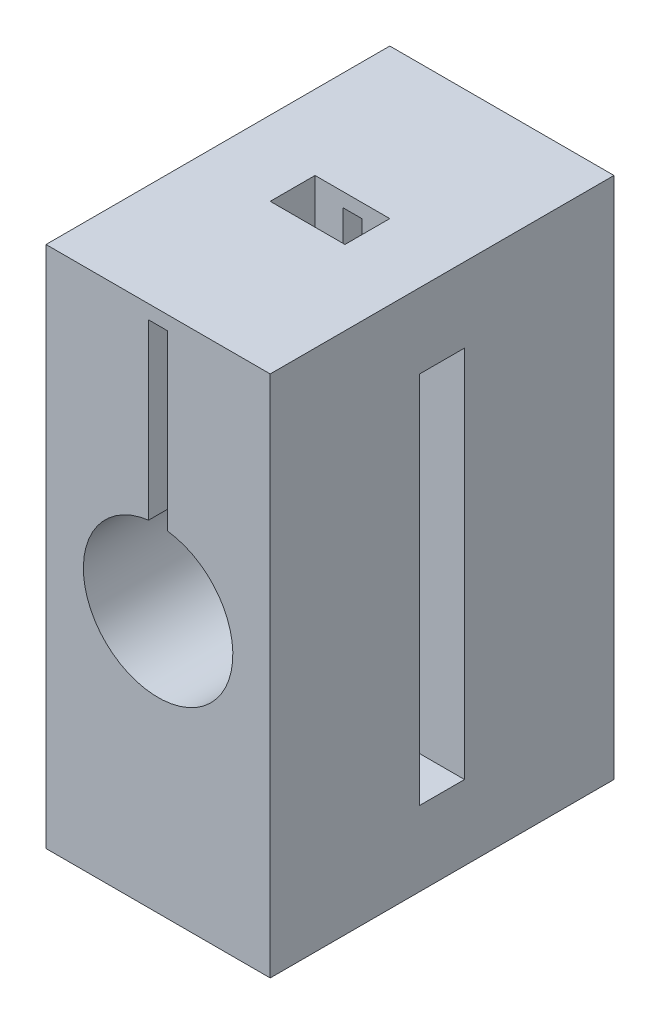
ISO-10303-21;
HEADER;
FILE_DESCRIPTION(('STEP AP214'),'2;1');
FILE_NAME('part.step','',(''),(''),'','','');
FILE_SCHEMA(('AUTOMOTIVE_DESIGN { 1 0 10303 214 1 1 1 1 }'));
ENDSEC;
DATA;
#1=APPLICATION_CONTEXT('core data for automotive mechanical design processes');
#2=APPLICATION_PROTOCOL_DEFINITION('international standard','automotive_design',2000,#1);
#3=PRODUCT_CONTEXT('',#1,'mechanical');
#4=PRODUCT('Part','Part','',(#3));
#5=PRODUCT_RELATED_PRODUCT_CATEGORY('part','',(#4));
#6=PRODUCT_DEFINITION_FORMATION('','',#4);
#7=PRODUCT_DEFINITION_CONTEXT('part definition',#1,'design');
#8=PRODUCT_DEFINITION('design','',#6,#7);
#9=PRODUCT_DEFINITION_SHAPE('','',#8);
#10=(LENGTH_UNIT() NAMED_UNIT(*) SI_UNIT(.MILLI.,.METRE.));
#11=(NAMED_UNIT(*) PLANE_ANGLE_UNIT() SI_UNIT($,.RADIAN.));
#12=(NAMED_UNIT(*) SI_UNIT($,.STERADIAN.) SOLID_ANGLE_UNIT());
#13=UNCERTAINTY_MEASURE_WITH_UNIT(LENGTH_MEASURE(1.E-05),#10,'distance_accuracy_value','');
#14=(GEOMETRIC_REPRESENTATION_CONTEXT(3) GLOBAL_UNCERTAINTY_ASSIGNED_CONTEXT((#13)) GLOBAL_UNIT_ASSIGNED_CONTEXT((#10,
#11,#12)) REPRESENTATION_CONTEXT('',''));
#15=CARTESIAN_POINT('',(0.,0.,0.));
#16=DIRECTION('',(0.,0.,1.));
#17=DIRECTION('',(1.,0.,0.));
#18=AXIS2_PLACEMENT_3D('',#15,#16,#17);
#19=CARTESIAN_POINT('',(0.,0.,10.));
#20=DIRECTION('',(0.,0.,1.));
#21=DIRECTION('',(1.,0.,0.));
#22=AXIS2_PLACEMENT_3D('',#19,#20,#21);
#23=PLANE('',#22);
#24=CARTESIAN_POINT('',(0.,0.,10.));
#25=DIRECTION('',(0.,0.,1.));
#26=DIRECTION('',(1.,0.,0.));
#27=AXIS2_PLACEMENT_3D('',#24,#25,#26);
#28=CIRCLE('',#27,1.6);
#29=CARTESIAN_POINT('',(1.6,0.,10.));
#30=VERTEX_POINT('',#29);
#31=EDGE_CURVE('E296',#30,#30,#28,.T.);
#32=ORIENTED_EDGE('',*,*,#31,.F.);
#33=EDGE_LOOP('',(#32));
#34=FACE_BOUND('',#33,.T.);
#35=DIRECTION('',(0.,-1.,0.));
#36=VECTOR('',#35,1.);
#37=CARTESIAN_POINT('',(-0.636453228328275,0.,10.));
#38=LINE('',#37,#36);
#39=CARTESIAN_POINT('',(-0.636453228328275,16.5648054593547,10.));
#40=VERTEX_POINT('',#39);
#41=CARTESIAN_POINT('',(-0.636453228328275,3.13869274702259,10.));
#42=VERTEX_POINT('',#41);
#43=EDGE_CURVE('E279',#40,#42,#38,.T.);
#44=ORIENTED_EDGE('',*,*,#43,.F.);
#45=DIRECTION('',(-1.,0.,0.));
#46=VECTOR('',#45,1.);
#47=CARTESIAN_POINT('',(0.,16.5648054593547,10.));
#48=LINE('',#47,#46);
#49=CARTESIAN_POINT('',(0.636453228328275,16.5648054593547,10.));
#50=VERTEX_POINT('',#49);
#51=EDGE_CURVE('E282',#50,#40,#48,.T.);
#52=ORIENTED_EDGE('',*,*,#51,.F.);
#53=DIRECTION('',(0.,-1.,0.));
#54=VECTOR('',#53,1.);
#55=CARTESIAN_POINT('',(0.636453228328275,0.,10.));
#56=LINE('',#55,#54);
#57=CARTESIAN_POINT('',(0.636453228328275,3.13869274702259,10.));
#58=VERTEX_POINT('',#57);
#59=EDGE_CURVE('E286',#50,#58,#56,.T.);
#60=ORIENTED_EDGE('',*,*,#59,.T.);
#61=DIRECTION('',(-1.,0.,0.));
#62=VECTOR('',#61,1.);
#63=CARTESIAN_POINT('',(0.,3.13869274702259,10.));
#64=LINE('',#63,#62);
#65=EDGE_CURVE('E288',#58,#42,#64,.T.);
#66=ORIENTED_EDGE('',*,*,#65,.T.);
#67=EDGE_LOOP('',(#44,#52,#60,#66));
#68=FACE_BOUND('',#67,.T.);
#69=DIRECTION('',(1.,0.,0.));
#70=VECTOR('',#69,1.);
#71=CARTESIAN_POINT('',(0.,12.5,10.));
#72=LINE('',#71,#70);
#73=CARTESIAN_POINT('',(2.5,12.5,10.));
#74=VERTEX_POINT('',#73);
#75=CARTESIAN_POINT('',(7.5,12.5,10.));
#76=VERTEX_POINT('',#75);
#77=EDGE_CURVE('E43',#74,#76,#72,.T.);
#78=ORIENTED_EDGE('',*,*,#77,.F.);
#79=DIRECTION('',(0.,1.,0.));
#80=VECTOR('',#79,1.);
#81=CARTESIAN_POINT('',(2.5,0.,10.));
#82=LINE('',#81,#80);
#83=CARTESIAN_POINT('',(2.5,17.5,10.));
#84=VERTEX_POINT('',#83);
#85=EDGE_CURVE('E11',#74,#84,#82,.T.);
#86=ORIENTED_EDGE('',*,*,#85,.T.);
#87=DIRECTION('',(-1.,0.,0.));
#88=VECTOR('',#87,1.);
#89=CARTESIAN_POINT('',(0.,17.5,10.));
#90=LINE('',#89,#88);
#91=CARTESIAN_POINT('',(-2.5,17.5,10.));
#92=VERTEX_POINT('',#91);
#93=EDGE_CURVE('E292',#84,#92,#90,.T.);
#94=ORIENTED_EDGE('',*,*,#93,.T.);
#95=DIRECTION('',(0.,1.,0.));
#96=VECTOR('',#95,1.);
#97=CARTESIAN_POINT('',(-2.5,0.,10.));
#98=LINE('',#97,#96);
#99=CARTESIAN_POINT('',(-2.5,12.5,10.));
#100=VERTEX_POINT('',#99);
#101=EDGE_CURVE('E342',#100,#92,#98,.T.);
#102=ORIENTED_EDGE('',*,*,#101,.F.);
#103=DIRECTION('',(-1.,0.,0.));
#104=VECTOR('',#103,1.);
#105=CARTESIAN_POINT('',(0.,12.5,10.));
#106=LINE('',#105,#104);
#107=CARTESIAN_POINT('',(-7.5,12.5,10.));
#108=VERTEX_POINT('',#107);
#109=EDGE_CURVE('E340',#100,#108,#106,.T.);
#110=ORIENTED_EDGE('',*,*,#109,.T.);
#111=DIRECTION('',(0.,-1.,0.));
#112=VECTOR('',#111,1.);
#113=CARTESIAN_POINT('',(-7.5,0.,10.));
#114=LINE('',#113,#112);
#115=CARTESIAN_POINT('',(-7.5,-12.5,10.));
#116=VERTEX_POINT('',#115);
#117=EDGE_CURVE('E294',#108,#116,#114,.T.);
#118=ORIENTED_EDGE('',*,*,#117,.T.);
#119=DIRECTION('',(-1.,0.,0.));
#120=VECTOR('',#119,1.);
#121=CARTESIAN_POINT('',(0.,-12.5,10.));
#122=LINE('',#121,#120);
#123=CARTESIAN_POINT('',(7.5,-12.5,10.));
#124=VERTEX_POINT('',#123);
#125=EDGE_CURVE('E330',#124,#116,#122,.T.);
#126=ORIENTED_EDGE('',*,*,#125,.F.);
#127=DIRECTION('',(0.,-1.,0.));
#128=VECTOR('',#127,1.);
#129=CARTESIAN_POINT('',(7.5,0.,10.));
#130=LINE('',#129,#128);
#131=EDGE_CURVE('E290',#76,#124,#130,.T.);
#132=ORIENTED_EDGE('',*,*,#131,.F.);
#133=EDGE_LOOP('',(#78,#86,#94,#102,#110,#118,#126,#132));
#134=FACE_BOUND('',#133,.T.);
#135=ADVANCED_FACE('F35',(#34,#68,#134),#23,.T.);
#136=CARTESIAN_POINT('',(0.,0.,0.));
#137=DIRECTION('',(0.,0.,1.));
#138=DIRECTION('',(1.,0.,0.));
#139=AXIS2_PLACEMENT_3D('',#136,#137,#138);
#140=PLANE('',#139);
#141=DIRECTION('',(0.,-1.,0.));
#142=VECTOR('',#141,1.);
#143=CARTESIAN_POINT('',(-7.5,0.,0.));
#144=LINE('',#143,#142);
#145=CARTESIAN_POINT('',(-7.5,17.5,0.));
#146=VERTEX_POINT('',#145);
#147=CARTESIAN_POINT('',(-7.5,-17.5,0.));
#148=VERTEX_POINT('',#147);
#149=EDGE_CURVE('E314',#146,#148,#144,.T.);
#150=ORIENTED_EDGE('',*,*,#149,.F.);
#151=DIRECTION('',(-1.,0.,0.));
#152=VECTOR('',#151,1.);
#153=CARTESIAN_POINT('',(0.,17.5,0.));
#154=LINE('',#153,#152);
#155=CARTESIAN_POINT('',(7.5,17.5,0.));
#156=VERTEX_POINT('',#155);
#157=EDGE_CURVE('E312',#156,#146,#154,.T.);
#158=ORIENTED_EDGE('',*,*,#157,.F.);
#159=DIRECTION('',(0.,-1.,0.));
#160=VECTOR('',#159,1.);
#161=CARTESIAN_POINT('',(7.5,0.,0.));
#162=LINE('',#161,#160);
#163=CARTESIAN_POINT('',(7.5,-17.5,0.));
#164=VERTEX_POINT('',#163);
#165=EDGE_CURVE('E310',#156,#164,#162,.T.);
#166=ORIENTED_EDGE('',*,*,#165,.T.);
#167=DIRECTION('',(-1.,0.,0.));
#168=VECTOR('',#167,1.);
#169=CARTESIAN_POINT('',(0.,-17.5,0.));
#170=LINE('',#169,#168);
#171=EDGE_CURVE('E283',#164,#148,#170,.T.);
#172=ORIENTED_EDGE('',*,*,#171,.T.);
#173=EDGE_LOOP('',(#150,#158,#166,#172));
#174=FACE_BOUND('',#173,.T.);
#175=CARTESIAN_POINT('',(0.,0.,0.));
#176=DIRECTION('',(0.,0.,1.));
#177=DIRECTION('',(1.,0.,0.));
#178=AXIS2_PLACEMENT_3D('',#175,#176,#177);
#179=CIRCLE('',#178,2.4);
#180=CARTESIAN_POINT('',(2.4,0.,0.));
#181=VERTEX_POINT('',#180);
#182=EDGE_CURVE('E269',#181,#181,#179,.T.);
#183=ORIENTED_EDGE('',*,*,#182,.T.);
#184=EDGE_LOOP('',(#183));
#185=FACE_BOUND('',#184,.T.);
#186=DIRECTION('',(0.,-1.,0.));
#187=VECTOR('',#186,1.);
#188=CARTESIAN_POINT('',(-0.636453228328275,0.,0.));
#189=LINE('',#188,#187);
#190=CARTESIAN_POINT('',(-0.636453228328275,16.5648054593547,0.));
#191=VERTEX_POINT('',#190);
#192=CARTESIAN_POINT('',(-0.636453228328275,3.13869274702259,0.));
#193=VERTEX_POINT('',#192);
#194=EDGE_CURVE('E276',#191,#193,#189,.T.);
#195=ORIENTED_EDGE('',*,*,#194,.T.);
#196=DIRECTION('',(-1.,0.,0.));
#197=VECTOR('',#196,1.);
#198=CARTESIAN_POINT('',(0.,3.13869274702259,0.));
#199=LINE('',#198,#197);
#200=CARTESIAN_POINT('',(0.636453228328275,3.13869274702259,0.));
#201=VERTEX_POINT('',#200);
#202=EDGE_CURVE('E307',#201,#193,#199,.T.);
#203=ORIENTED_EDGE('',*,*,#202,.F.);
#204=DIRECTION('',(0.,-1.,0.));
#205=VECTOR('',#204,1.);
#206=CARTESIAN_POINT('',(0.636453228328275,0.,0.));
#207=LINE('',#206,#205);
#208=CARTESIAN_POINT('',(0.636453228328275,16.5648054593547,0.));
#209=VERTEX_POINT('',#208);
#210=EDGE_CURVE('E305',#209,#201,#207,.T.);
#211=ORIENTED_EDGE('',*,*,#210,.F.);
#212=DIRECTION('',(-1.,0.,0.));
#213=VECTOR('',#212,1.);
#214=CARTESIAN_POINT('',(0.,16.5648054593547,0.));
#215=LINE('',#214,#213);
#216=EDGE_CURVE('E302',#209,#191,#215,.T.);
#217=ORIENTED_EDGE('',*,*,#216,.T.);
#218=EDGE_LOOP('',(#195,#203,#211,#217));
#219=FACE_BOUND('',#218,.T.);
#220=ADVANCED_FACE('F384',(#174,#185,#219),#140,.F.);
#221=CARTESIAN_POINT('',(7.5,0.,10.));
#222=DIRECTION('',(1.,0.,0.));
#223=DIRECTION('',(0.,1.,0.));
#224=AXIS2_PLACEMENT_3D('',#221,#222,#223);
#225=PLANE('',#224);
#226=DIRECTION('',(0.,-1.,0.));
#227=VECTOR('',#226,1.);
#228=CARTESIAN_POINT('',(7.5,0.,23.));
#229=LINE('',#228,#227);
#230=CARTESIAN_POINT('',(7.5,17.5,23.));
#231=VERTEX_POINT('',#230);
#232=CARTESIAN_POINT('',(7.5,-17.5,23.));
#233=VERTEX_POINT('',#232);
#234=EDGE_CURVE('E203',#231,#233,#229,.T.);
#235=ORIENTED_EDGE('',*,*,#234,.T.);
#236=DIRECTION('',(0.,0.,-1.));
#237=VECTOR('',#236,1.);
#238=CARTESIAN_POINT('',(7.5,-17.5,10.));
#239=LINE('',#238,#237);
#240=EDGE_CURVE('E318',#233,#164,#239,.T.);
#241=ORIENTED_EDGE('',*,*,#240,.T.);
#242=ORIENTED_EDGE('',*,*,#165,.F.);
#243=DIRECTION('',(0.,0.,-1.));
#244=VECTOR('',#243,1.);
#245=CARTESIAN_POINT('',(7.5,17.5,10.));
#246=LINE('',#245,#244);
#247=EDGE_CURVE('E328',#231,#156,#246,.T.);
#248=ORIENTED_EDGE('',*,*,#247,.F.);
#249=EDGE_LOOP('',(#235,#241,#242,#248));
#250=FACE_BOUND('',#249,.T.);
#251=DIRECTION('',(0.,0.,-1.));
#252=VECTOR('',#251,1.);
#253=CARTESIAN_POINT('',(7.5,-12.5,13.));
#254=LINE('',#253,#252);
#255=CARTESIAN_POINT('',(7.5,-12.5,13.));
#256=VERTEX_POINT('',#255);
#257=EDGE_CURVE('E263',#256,#124,#254,.T.);
#258=ORIENTED_EDGE('',*,*,#257,.F.);
#259=DIRECTION('',(0.,-1.,0.));
#260=VECTOR('',#259,1.);
#261=CARTESIAN_POINT('',(7.5,0.,13.));
#262=LINE('',#261,#260);
#263=CARTESIAN_POINT('',(7.5,12.5,13.));
#264=VERTEX_POINT('',#263);
#265=EDGE_CURVE('E225',#264,#256,#262,.T.);
#266=ORIENTED_EDGE('',*,*,#265,.F.);
#267=DIRECTION('',(0.,0.,-1.));
#268=VECTOR('',#267,1.);
#269=CARTESIAN_POINT('',(7.5,12.5,13.));
#270=LINE('',#269,#268);
#271=EDGE_CURVE('E50',#264,#76,#270,.T.);
#272=ORIENTED_EDGE('',*,*,#271,.T.);
#273=ORIENTED_EDGE('',*,*,#131,.T.);
#274=EDGE_LOOP('',(#258,#266,#272,#273));
#275=FACE_BOUND('',#274,.T.);
#276=ADVANCED_FACE('F352',(#250,#275),#225,.T.);
#277=CARTESIAN_POINT('',(0.,17.5,10.));
#278=DIRECTION('',(0.,-1.,0.));
#279=DIRECTION('',(0.,0.,-1.));
#280=AXIS2_PLACEMENT_3D('',#277,#278,#279);
#281=PLANE('',#280);
#282=DIRECTION('',(0.,0.,-1.));
#283=VECTOR('',#282,1.);
#284=CARTESIAN_POINT('',(-7.5,17.5,10.));
#285=LINE('',#284,#283);
#286=CARTESIAN_POINT('',(-7.5,17.5,23.));
#287=VERTEX_POINT('',#286);
#288=EDGE_CURVE('E325',#287,#146,#285,.T.);
#289=ORIENTED_EDGE('',*,*,#288,.F.);
#290=DIRECTION('',(-1.,0.,0.));
#291=VECTOR('',#290,1.);
#292=CARTESIAN_POINT('',(0.,17.5,23.));
#293=LINE('',#292,#291);
#294=EDGE_CURVE('E206',#231,#287,#293,.T.);
#295=ORIENTED_EDGE('',*,*,#294,.F.);
#296=ORIENTED_EDGE('',*,*,#247,.T.);
#297=ORIENTED_EDGE('',*,*,#157,.T.);
#298=EDGE_LOOP('',(#289,#295,#296,#297));
#299=FACE_BOUND('',#298,.T.);
#300=DIRECTION('',(-1.,0.,0.));
#301=VECTOR('',#300,1.);
#302=CARTESIAN_POINT('',(0.,17.5,13.));
#303=LINE('',#302,#301);
#304=CARTESIAN_POINT('',(2.5,17.5,13.));
#305=VERTEX_POINT('',#304);
#306=CARTESIAN_POINT('',(-2.5,17.5,13.));
#307=VERTEX_POINT('',#306);
#308=EDGE_CURVE('E227',#305,#307,#303,.T.);
#309=ORIENTED_EDGE('',*,*,#308,.T.);
#310=DIRECTION('',(0.,0.,-1.));
#311=VECTOR('',#310,1.);
#312=CARTESIAN_POINT('',(-2.5,17.5,13.));
#313=LINE('',#312,#311);
#314=EDGE_CURVE('E257',#307,#92,#313,.T.);
#315=ORIENTED_EDGE('',*,*,#314,.T.);
#316=ORIENTED_EDGE('',*,*,#93,.F.);
#317=DIRECTION('',(0.,0.,-1.));
#318=VECTOR('',#317,1.);
#319=CARTESIAN_POINT('',(2.5,17.5,13.));
#320=LINE('',#319,#318);
#321=EDGE_CURVE('E245',#305,#84,#320,.T.);
#322=ORIENTED_EDGE('',*,*,#321,.F.);
#323=EDGE_LOOP('',(#309,#315,#316,#322));
#324=FACE_BOUND('',#323,.T.);
#325=ADVANCED_FACE('F370',(#299,#324),#281,.F.);
#326=CARTESIAN_POINT('',(-7.5,0.,10.));
#327=DIRECTION('',(1.,0.,0.));
#328=DIRECTION('',(0.,1.,0.));
#329=AXIS2_PLACEMENT_3D('',#326,#327,#328);
#330=PLANE('',#329);
#331=DIRECTION('',(0.,0.,-1.));
#332=VECTOR('',#331,1.);
#333=CARTESIAN_POINT('',(-7.5,-17.5,10.));
#334=LINE('',#333,#332);
#335=CARTESIAN_POINT('',(-7.5,-17.5,23.));
#336=VERTEX_POINT('',#335);
#337=EDGE_CURVE('E321',#336,#148,#334,.T.);
#338=ORIENTED_EDGE('',*,*,#337,.F.);
#339=DIRECTION('',(0.,-1.,0.));
#340=VECTOR('',#339,1.);
#341=CARTESIAN_POINT('',(-7.5,0.,23.));
#342=LINE('',#341,#340);
#343=EDGE_CURVE('E209',#287,#336,#342,.T.);
#344=ORIENTED_EDGE('',*,*,#343,.F.);
#345=ORIENTED_EDGE('',*,*,#288,.T.);
#346=ORIENTED_EDGE('',*,*,#149,.T.);
#347=EDGE_LOOP('',(#338,#344,#345,#346));
#348=FACE_BOUND('',#347,.T.);
#349=DIRECTION('',(0.,-1.,0.));
#350=VECTOR('',#349,1.);
#351=CARTESIAN_POINT('',(-7.5,0.,13.));
#352=LINE('',#351,#350);
#353=CARTESIAN_POINT('',(-7.5,12.5,13.));
#354=VERTEX_POINT('',#353);
#355=CARTESIAN_POINT('',(-7.5,-12.5,13.));
#356=VERTEX_POINT('',#355);
#357=EDGE_CURVE('E195',#354,#356,#352,.T.);
#358=ORIENTED_EDGE('',*,*,#357,.T.);
#359=DIRECTION('',(0.,0.,-1.));
#360=VECTOR('',#359,1.);
#361=CARTESIAN_POINT('',(-7.5,-12.5,13.));
#362=LINE('',#361,#360);
#363=EDGE_CURVE('E266',#356,#116,#362,.T.);
#364=ORIENTED_EDGE('',*,*,#363,.T.);
#365=ORIENTED_EDGE('',*,*,#117,.F.);
#366=DIRECTION('',(0.,0.,-1.));
#367=VECTOR('',#366,1.);
#368=CARTESIAN_POINT('',(-7.5,12.5,13.));
#369=LINE('',#368,#367);
#370=EDGE_CURVE('E58',#354,#108,#369,.T.);
#371=ORIENTED_EDGE('',*,*,#370,.F.);
#372=EDGE_LOOP('',(#358,#364,#365,#371));
#373=FACE_BOUND('',#372,.T.);
#374=ADVANCED_FACE('F361',(#348,#373),#330,.F.);
#375=CARTESIAN_POINT('',(-0.636453228328275,0.,10.));
#376=DIRECTION('',(1.,0.,0.));
#377=DIRECTION('',(0.,0.,-1.));
#378=AXIS2_PLACEMENT_3D('',#375,#376,#377);
#379=PLANE('',#378);
#380=ORIENTED_EDGE('',*,*,#194,.F.);
#381=DIRECTION('',(0.,0.,-1.));
#382=VECTOR('',#381,1.);
#383=CARTESIAN_POINT('',(-0.636453228328275,16.5648054593547,10.));
#384=LINE('',#383,#382);
#385=EDGE_CURVE('E322',#40,#191,#384,.T.);
#386=ORIENTED_EDGE('',*,*,#385,.F.);
#387=ORIENTED_EDGE('',*,*,#43,.T.);
#388=DIRECTION('',(0.,0.,-1.));
#389=VECTOR('',#388,1.);
#390=CARTESIAN_POINT('',(-0.636453228328275,3.13869274702259,10.));
#391=LINE('',#390,#389);
#392=EDGE_CURVE('E299',#42,#193,#391,.T.);
#393=ORIENTED_EDGE('',*,*,#392,.T.);
#394=EDGE_LOOP('',(#380,#386,#387,#393));
#395=FACE_BOUND('',#394,.T.);
#396=ADVANCED_FACE('F37',(#395),#379,.T.);
#397=CARTESIAN_POINT('',(0.,16.5648054593547,10.));
#398=DIRECTION('',(0.,-1.,0.));
#399=DIRECTION('',(0.,0.,-1.));
#400=AXIS2_PLACEMENT_3D('',#397,#398,#399);
#401=PLANE('',#400);
#402=ORIENTED_EDGE('',*,*,#216,.F.);
#403=DIRECTION('',(0.,0.,-1.));
#404=VECTOR('',#403,1.);
#405=CARTESIAN_POINT('',(0.636453228328275,16.5648054593547,10.));
#406=LINE('',#405,#404);
#407=EDGE_CURVE('E335',#50,#209,#406,.T.);
#408=ORIENTED_EDGE('',*,*,#407,.F.);
#409=ORIENTED_EDGE('',*,*,#51,.T.);
#410=ORIENTED_EDGE('',*,*,#385,.T.);
#411=EDGE_LOOP('',(#402,#408,#409,#410));
#412=FACE_BOUND('',#411,.T.);
#413=ADVANCED_FACE('F421',(#412),#401,.T.);
#414=CARTESIAN_POINT('',(0.636453228328275,0.,10.));
#415=DIRECTION('',(1.,0.,0.));
#416=DIRECTION('',(0.,0.,-1.));
#417=AXIS2_PLACEMENT_3D('',#414,#415,#416);
#418=PLANE('',#417);
#419=ORIENTED_EDGE('',*,*,#210,.T.);
#420=DIRECTION('',(0.,0.,-1.));
#421=VECTOR('',#420,1.);
#422=CARTESIAN_POINT('',(0.636453228328275,3.13869274702259,10.));
#423=LINE('',#422,#421);
#424=EDGE_CURVE('E332',#58,#201,#423,.T.);
#425=ORIENTED_EDGE('',*,*,#424,.F.);
#426=ORIENTED_EDGE('',*,*,#59,.F.);
#427=ORIENTED_EDGE('',*,*,#407,.T.);
#428=EDGE_LOOP('',(#419,#425,#426,#427));
#429=FACE_BOUND('',#428,.T.);
#430=ADVANCED_FACE('F406',(#429),#418,.F.);
#431=CARTESIAN_POINT('',(0.,-17.5,10.));
#432=DIRECTION('',(0.,-1.,0.));
#433=DIRECTION('',(0.,0.,-1.));
#434=AXIS2_PLACEMENT_3D('',#431,#432,#433);
#435=PLANE('',#434);
#436=ORIENTED_EDGE('',*,*,#171,.F.);
#437=ORIENTED_EDGE('',*,*,#240,.F.);
#438=DIRECTION('',(-1.,0.,0.));
#439=VECTOR('',#438,1.);
#440=CARTESIAN_POINT('',(0.,-17.5,23.));
#441=LINE('',#440,#439);
#442=EDGE_CURVE('E212',#233,#336,#441,.T.);
#443=ORIENTED_EDGE('',*,*,#442,.T.);
#444=ORIENTED_EDGE('',*,*,#337,.T.);
#445=EDGE_LOOP('',(#436,#437,#443,#444));
#446=FACE_BOUND('',#445,.T.);
#447=ADVANCED_FACE('F403',(#446),#435,.T.);
#448=CARTESIAN_POINT('',(0.,3.13869274702259,10.));
#449=DIRECTION('',(0.,-1.,0.));
#450=DIRECTION('',(0.,0.,-1.));
#451=AXIS2_PLACEMENT_3D('',#448,#449,#450);
#452=PLANE('',#451);
#453=ORIENTED_EDGE('',*,*,#202,.T.);
#454=ORIENTED_EDGE('',*,*,#392,.F.);
#455=ORIENTED_EDGE('',*,*,#65,.F.);
#456=ORIENTED_EDGE('',*,*,#424,.T.);
#457=EDGE_LOOP('',(#453,#454,#455,#456));
#458=FACE_BOUND('',#457,.T.);
#459=ADVANCED_FACE('F401',(#458),#452,.F.);
#460=CARTESIAN_POINT('',(0.,0.,10.));
#461=DIRECTION('',(0.,0.,-1.));
#462=DIRECTION('',(-1.,0.,0.));
#463=AXIS2_PLACEMENT_3D('',#460,#461,#462);
#464=CYLINDRICAL_SURFACE('',#463,1.6);
#465=CARTESIAN_POINT('',(0.,0.,8.));
#466=DIRECTION('',(0.,0.,1.));
#467=DIRECTION('',(1.,0.,0.));
#468=AXIS2_PLACEMENT_3D('',#465,#466,#467);
#469=CIRCLE('',#468,1.6);
#470=CARTESIAN_POINT('',(1.6,0.,8.));
#471=VERTEX_POINT('',#470);
#472=EDGE_CURVE('E270',#471,#471,#469,.T.);
#473=ORIENTED_EDGE('',*,*,#472,.F.);
#474=EDGE_LOOP('',(#473));
#475=FACE_BOUND('',#474,.T.);
#476=ORIENTED_EDGE('',*,*,#31,.T.);
#477=EDGE_LOOP('',(#476));
#478=FACE_BOUND('',#477,.T.);
#479=ADVANCED_FACE('F398',(#475,#478),#464,.F.);
#480=CARTESIAN_POINT('',(0.,0.,8.));
#481=DIRECTION('',(0.,0.,-1.));
#482=DIRECTION('',(-1.,0.,0.));
#483=AXIS2_PLACEMENT_3D('',#480,#481,#482);
#484=CYLINDRICAL_SURFACE('',#483,2.4);
#485=CARTESIAN_POINT('',(0.,0.,8.));
#486=DIRECTION('',(0.,0.,1.));
#487=DIRECTION('',(1.,0.,0.));
#488=AXIS2_PLACEMENT_3D('',#485,#486,#487);
#489=CIRCLE('',#488,2.4);
#490=CARTESIAN_POINT('',(2.4,0.,8.));
#491=VERTEX_POINT('',#490);
#492=EDGE_CURVE('E273',#491,#491,#489,.T.);
#493=ORIENTED_EDGE('',*,*,#492,.T.);
#494=EDGE_LOOP('',(#493));
#495=FACE_BOUND('',#494,.T.);
#496=ORIENTED_EDGE('',*,*,#182,.F.);
#497=EDGE_LOOP('',(#496));
#498=FACE_BOUND('',#497,.T.);
#499=ADVANCED_FACE('F395',(#495,#498),#484,.F.);
#500=CARTESIAN_POINT('',(0.,0.,8.));
#501=DIRECTION('',(0.,0.,1.));
#502=DIRECTION('',(1.,0.,0.));
#503=AXIS2_PLACEMENT_3D('',#500,#501,#502);
#504=PLANE('',#503);
#505=ORIENTED_EDGE('',*,*,#472,.T.);
#506=EDGE_LOOP('',(#505));
#507=FACE_BOUND('',#506,.T.);
#508=ORIENTED_EDGE('',*,*,#492,.F.);
#509=EDGE_LOOP('',(#508));
#510=FACE_BOUND('',#509,.T.);
#511=ADVANCED_FACE('F472',(#507,#510),#504,.F.);
#512=CARTESIAN_POINT('',(0.,-12.5,13.));
#513=DIRECTION('',(0.,1.,0.));
#514=DIRECTION('',(0.,0.,1.));
#515=AXIS2_PLACEMENT_3D('',#512,#513,#514);
#516=PLANE('',#515);
#517=ORIENTED_EDGE('',*,*,#257,.T.);
#518=ORIENTED_EDGE('',*,*,#125,.T.);
#519=ORIENTED_EDGE('',*,*,#363,.F.);
#520=DIRECTION('',(1.,0.,0.));
#521=VECTOR('',#520,1.);
#522=CARTESIAN_POINT('',(0.,-12.5,13.));
#523=LINE('',#522,#521);
#524=EDGE_CURVE('E260',#356,#256,#523,.T.);
#525=ORIENTED_EDGE('',*,*,#524,.T.);
#526=EDGE_LOOP('',(#517,#518,#519,#525));
#527=FACE_BOUND('',#526,.T.);
#528=ADVANCED_FACE('F354',(#527),#516,.T.);
#529=CARTESIAN_POINT('',(-2.5,0.,13.));
#530=DIRECTION('',(1.,0.,0.));
#531=DIRECTION('',(0.,0.,-1.));
#532=AXIS2_PLACEMENT_3D('',#529,#530,#531);
#533=PLANE('',#532);
#534=DIRECTION('',(0.,0.,-1.));
#535=VECTOR('',#534,1.);
#536=CARTESIAN_POINT('',(-2.5,12.5,13.));
#537=LINE('',#536,#535);
#538=CARTESIAN_POINT('',(-2.5,12.5,13.));
#539=VERTEX_POINT('',#538);
#540=EDGE_CURVE('E253',#539,#100,#537,.T.);
#541=ORIENTED_EDGE('',*,*,#540,.T.);
#542=ORIENTED_EDGE('',*,*,#101,.T.);
#543=ORIENTED_EDGE('',*,*,#314,.F.);
#544=DIRECTION('',(0.,-1.,0.));
#545=VECTOR('',#544,1.);
#546=CARTESIAN_POINT('',(-2.5,0.,13.));
#547=LINE('',#546,#545);
#548=EDGE_CURVE('E247',#307,#539,#547,.T.);
#549=ORIENTED_EDGE('',*,*,#548,.T.);
#550=EDGE_LOOP('',(#541,#542,#543,#549));
#551=FACE_BOUND('',#550,.T.);
#552=ADVANCED_FACE('F366',(#551),#533,.T.);
#553=CARTESIAN_POINT('',(0.,12.5,13.));
#554=DIRECTION('',(0.,1.,0.));
#555=DIRECTION('',(0.,0.,1.));
#556=AXIS2_PLACEMENT_3D('',#553,#554,#555);
#557=PLANE('',#556);
#558=ORIENTED_EDGE('',*,*,#109,.F.);
#559=ORIENTED_EDGE('',*,*,#540,.F.);
#560=DIRECTION('',(1.,0.,0.));
#561=VECTOR('',#560,1.);
#562=CARTESIAN_POINT('',(0.,12.5,13.));
#563=LINE('',#562,#561);
#564=EDGE_CURVE('E250',#354,#539,#563,.T.);
#565=ORIENTED_EDGE('',*,*,#564,.F.);
#566=ORIENTED_EDGE('',*,*,#370,.T.);
#567=EDGE_LOOP('',(#558,#559,#565,#566));
#568=FACE_BOUND('',#567,.T.);
#569=ADVANCED_FACE('F364',(#568),#557,.F.);
#570=CARTESIAN_POINT('',(2.5,0.,13.));
#571=DIRECTION('',(1.,0.,0.));
#572=DIRECTION('',(0.,1.,0.));
#573=AXIS2_PLACEMENT_3D('',#570,#571,#572);
#574=PLANE('',#573);
#575=ORIENTED_EDGE('',*,*,#85,.F.);
#576=DIRECTION('',(0.,0.,-1.));
#577=VECTOR('',#576,1.);
#578=CARTESIAN_POINT('',(2.5,12.5,13.));
#579=LINE('',#578,#577);
#580=CARTESIAN_POINT('',(2.5,12.5,13.));
#581=VERTEX_POINT('',#580);
#582=EDGE_CURVE('E242',#581,#74,#579,.T.);
#583=ORIENTED_EDGE('',*,*,#582,.F.);
#584=DIRECTION('',(0.,-1.,0.));
#585=VECTOR('',#584,1.);
#586=CARTESIAN_POINT('',(2.5,0.,13.));
#587=LINE('',#586,#585);
#588=EDGE_CURVE('E182',#305,#581,#587,.T.);
#589=ORIENTED_EDGE('',*,*,#588,.F.);
#590=ORIENTED_EDGE('',*,*,#321,.T.);
#591=EDGE_LOOP('',(#575,#583,#589,#590));
#592=FACE_BOUND('',#591,.T.);
#593=ADVANCED_FACE('F374',(#592),#574,.F.);
#594=CARTESIAN_POINT('',(0.,12.5,13.));
#595=DIRECTION('',(0.,-1.,0.));
#596=DIRECTION('',(1.,0.,0.));
#597=AXIS2_PLACEMENT_3D('',#594,#595,#596);
#598=PLANE('',#597);
#599=ORIENTED_EDGE('',*,*,#582,.T.);
#600=ORIENTED_EDGE('',*,*,#77,.T.);
#601=ORIENTED_EDGE('',*,*,#271,.F.);
#602=DIRECTION('',(-1.,0.,0.));
#603=VECTOR('',#602,1.);
#604=CARTESIAN_POINT('',(0.,12.5,13.));
#605=LINE('',#604,#603);
#606=EDGE_CURVE('E238',#264,#581,#605,.T.);
#607=ORIENTED_EDGE('',*,*,#606,.T.);
#608=EDGE_LOOP('',(#599,#600,#601,#607));
#609=FACE_BOUND('',#608,.T.);
#610=ADVANCED_FACE('F347',(#609),#598,.T.);
#611=CARTESIAN_POINT('',(0.,0.,13.));
#612=DIRECTION('',(0.,0.,1.));
#613=DIRECTION('',(1.,0.,0.));
#614=AXIS2_PLACEMENT_3D('',#611,#612,#613);
#615=PLANE('',#614);
#616=ORIENTED_EDGE('',*,*,#524,.F.);
#617=ORIENTED_EDGE('',*,*,#357,.F.);
#618=ORIENTED_EDGE('',*,*,#564,.T.);
#619=ORIENTED_EDGE('',*,*,#548,.F.);
#620=ORIENTED_EDGE('',*,*,#308,.F.);
#621=ORIENTED_EDGE('',*,*,#588,.T.);
#622=ORIENTED_EDGE('',*,*,#606,.F.);
#623=ORIENTED_EDGE('',*,*,#265,.T.);
#624=EDGE_LOOP('',(#616,#617,#618,#619,#620,#621,#622,#623));
#625=FACE_BOUND('',#624,.T.);
#626=CARTESIAN_POINT('',(0.,0.,13.));
#627=DIRECTION('',(0.,0.,1.));
#628=DIRECTION('',(1.,0.,0.));
#629=AXIS2_PLACEMENT_3D('',#626,#627,#628);
#630=CIRCLE('',#629,5.);
#631=CARTESIAN_POINT('',(-0.636453228328275,4.95932730197862,13.));
#632=VERTEX_POINT('',#631);
#633=CARTESIAN_POINT('',(0.636453228328275,4.95932730197862,13.));
#634=VERTEX_POINT('',#633);
#635=EDGE_CURVE('E177',#632,#634,#630,.T.);
#636=ORIENTED_EDGE('',*,*,#635,.T.);
#637=DIRECTION('',(0.,-1.,0.));
#638=VECTOR('',#637,1.);
#639=CARTESIAN_POINT('',(0.636453228328275,0.,13.));
#640=LINE('',#639,#638);
#641=CARTESIAN_POINT('',(0.636453228328275,16.5648054593547,13.));
#642=VERTEX_POINT('',#641);
#643=EDGE_CURVE('E222',#642,#634,#640,.T.);
#644=ORIENTED_EDGE('',*,*,#643,.F.);
#645=DIRECTION('',(-1.,0.,0.));
#646=VECTOR('',#645,1.);
#647=CARTESIAN_POINT('',(0.,16.5648054593547,13.));
#648=LINE('',#647,#646);
#649=CARTESIAN_POINT('',(-0.636453228328275,16.5648054593547,13.));
#650=VERTEX_POINT('',#649);
#651=EDGE_CURVE('E219',#642,#650,#648,.T.);
#652=ORIENTED_EDGE('',*,*,#651,.T.);
#653=DIRECTION('',(0.,-1.,0.));
#654=VECTOR('',#653,1.);
#655=CARTESIAN_POINT('',(-0.636453228328275,0.,13.));
#656=LINE('',#655,#654);
#657=EDGE_CURVE('E217',#650,#632,#656,.T.);
#658=ORIENTED_EDGE('',*,*,#657,.T.);
#659=EDGE_LOOP('',(#636,#644,#652,#658));
#660=FACE_BOUND('',#659,.T.);
#661=ADVANCED_FACE('F358',(#625,#660),#615,.F.);
#662=CARTESIAN_POINT('',(0.,0.,23.));
#663=DIRECTION('',(0.,0.,-1.));
#664=DIRECTION('',(-1.,0.,0.));
#665=AXIS2_PLACEMENT_3D('',#662,#663,#664);
#666=CYLINDRICAL_SURFACE('',#665,5.);
#667=ORIENTED_EDGE('',*,*,#635,.F.);
#668=DIRECTION('',(0.,0.,-1.));
#669=VECTOR('',#668,1.);
#670=CARTESIAN_POINT('',(-0.636453228328275,4.95932730197862,23.));
#671=LINE('',#670,#669);
#672=CARTESIAN_POINT('',(-0.636453228328275,4.95932730197862,23.));
#673=VERTEX_POINT('',#672);
#674=EDGE_CURVE('E172',#673,#632,#671,.T.);
#675=ORIENTED_EDGE('',*,*,#674,.F.);
#676=CARTESIAN_POINT('',(0.,0.,23.));
#677=DIRECTION('',(0.,0.,1.));
#678=DIRECTION('',(1.,0.,0.));
#679=AXIS2_PLACEMENT_3D('',#676,#677,#678);
#680=CIRCLE('',#679,5.);
#681=CARTESIAN_POINT('',(0.636453228328275,4.95932730197862,23.));
#682=VERTEX_POINT('',#681);
#683=EDGE_CURVE('E175',#673,#682,#680,.T.);
#684=ORIENTED_EDGE('',*,*,#683,.T.);
#685=DIRECTION('',(0.,0.,-1.));
#686=VECTOR('',#685,1.);
#687=CARTESIAN_POINT('',(0.636453228328275,4.95932730197862,23.));
#688=LINE('',#687,#686);
#689=EDGE_CURVE('E215',#682,#634,#688,.T.);
#690=ORIENTED_EDGE('',*,*,#689,.T.);
#691=EDGE_LOOP('',(#667,#675,#684,#690));
#692=FACE_BOUND('',#691,.T.);
#693=ADVANCED_FACE('F174',(#692),#666,.F.);
#694=CARTESIAN_POINT('',(-0.636453228328275,0.,23.));
#695=DIRECTION('',(1.,0.,0.));
#696=DIRECTION('',(0.,0.,-1.));
#697=AXIS2_PLACEMENT_3D('',#694,#695,#696);
#698=PLANE('',#697);
#699=ORIENTED_EDGE('',*,*,#657,.F.);
#700=DIRECTION('',(0.,0.,-1.));
#701=VECTOR('',#700,1.);
#702=CARTESIAN_POINT('',(-0.636453228328275,16.5648054593547,23.));
#703=LINE('',#702,#701);
#704=CARTESIAN_POINT('',(-0.636453228328275,16.5648054593547,23.));
#705=VERTEX_POINT('',#704);
#706=EDGE_CURVE('E183',#705,#650,#703,.T.);
#707=ORIENTED_EDGE('',*,*,#706,.F.);
#708=DIRECTION('',(0.,-1.,0.));
#709=VECTOR('',#708,1.);
#710=CARTESIAN_POINT('',(-0.636453228328275,0.,23.));
#711=LINE('',#710,#709);
#712=EDGE_CURVE('E190',#705,#673,#711,.T.);
#713=ORIENTED_EDGE('',*,*,#712,.T.);
#714=ORIENTED_EDGE('',*,*,#674,.T.);
#715=EDGE_LOOP('',(#699,#707,#713,#714));
#716=FACE_BOUND('',#715,.T.);
#717=ADVANCED_FACE('F197',(#716),#698,.T.);
#718=CARTESIAN_POINT('',(0.,16.5648054593547,23.));
#719=DIRECTION('',(0.,-1.,0.));
#720=DIRECTION('',(0.,0.,-1.));
#721=AXIS2_PLACEMENT_3D('',#718,#719,#720);
#722=PLANE('',#721);
#723=ORIENTED_EDGE('',*,*,#651,.F.);
#724=DIRECTION('',(0.,0.,-1.));
#725=VECTOR('',#724,1.);
#726=CARTESIAN_POINT('',(0.636453228328275,16.5648054593547,23.));
#727=LINE('',#726,#725);
#728=CARTESIAN_POINT('',(0.636453228328275,16.5648054593547,23.));
#729=VERTEX_POINT('',#728);
#730=EDGE_CURVE('E233',#729,#642,#727,.T.);
#731=ORIENTED_EDGE('',*,*,#730,.F.);
#732=DIRECTION('',(-1.,0.,0.));
#733=VECTOR('',#732,1.);
#734=CARTESIAN_POINT('',(0.,16.5648054593547,23.));
#735=LINE('',#734,#733);
#736=EDGE_CURVE('E198',#729,#705,#735,.T.);
#737=ORIENTED_EDGE('',*,*,#736,.T.);
#738=ORIENTED_EDGE('',*,*,#706,.T.);
#739=EDGE_LOOP('',(#723,#731,#737,#738));
#740=FACE_BOUND('',#739,.T.);
#741=ADVANCED_FACE('F626',(#740),#722,.T.);
#742=CARTESIAN_POINT('',(0.636453228328275,0.,23.));
#743=DIRECTION('',(1.,0.,0.));
#744=DIRECTION('',(0.,0.,-1.));
#745=AXIS2_PLACEMENT_3D('',#742,#743,#744);
#746=PLANE('',#745);
#747=ORIENTED_EDGE('',*,*,#643,.T.);
#748=ORIENTED_EDGE('',*,*,#689,.F.);
#749=DIRECTION('',(0.,-1.,0.));
#750=VECTOR('',#749,1.);
#751=CARTESIAN_POINT('',(0.636453228328275,0.,23.));
#752=LINE('',#751,#750);
#753=EDGE_CURVE('E193',#729,#682,#752,.T.);
#754=ORIENTED_EDGE('',*,*,#753,.F.);
#755=ORIENTED_EDGE('',*,*,#730,.T.);
#756=EDGE_LOOP('',(#747,#748,#754,#755));
#757=FACE_BOUND('',#756,.T.);
#758=ADVANCED_FACE('F634',(#757),#746,.F.);
#759=CARTESIAN_POINT('',(0.,0.,23.));
#760=DIRECTION('',(0.,0.,1.));
#761=DIRECTION('',(1.,0.,0.));
#762=AXIS2_PLACEMENT_3D('',#759,#760,#761);
#763=PLANE('',#762);
#764=ORIENTED_EDGE('',*,*,#683,.F.);
#765=ORIENTED_EDGE('',*,*,#712,.F.);
#766=ORIENTED_EDGE('',*,*,#736,.F.);
#767=ORIENTED_EDGE('',*,*,#753,.T.);
#768=EDGE_LOOP('',(#764,#765,#766,#767));
#769=FACE_BOUND('',#768,.T.);
#770=ORIENTED_EDGE('',*,*,#234,.F.);
#771=ORIENTED_EDGE('',*,*,#294,.T.);
#772=ORIENTED_EDGE('',*,*,#343,.T.);
#773=ORIENTED_EDGE('',*,*,#442,.F.);
#774=EDGE_LOOP('',(#770,#771,#772,#773));
#775=FACE_BOUND('',#774,.T.);
#776=ADVANCED_FACE('F187',(#769,#775),#763,.T.);
#777=CLOSED_SHELL('',(#135,#220,#276,#325,#374,#396,#413,#430,#447,#459,#479,#499,#511,#528,
#552,#569,#593,#610,#661,#693,#717,#741,#758,#776));
#778=MANIFOLD_SOLID_BREP('B2',#777);
#779=ADVANCED_BREP_SHAPE_REPRESENTATION('',(#18,#778),#14);
#780=SHAPE_DEFINITION_REPRESENTATION(#9,#779);
ENDSEC;
END-ISO-10303-21;
